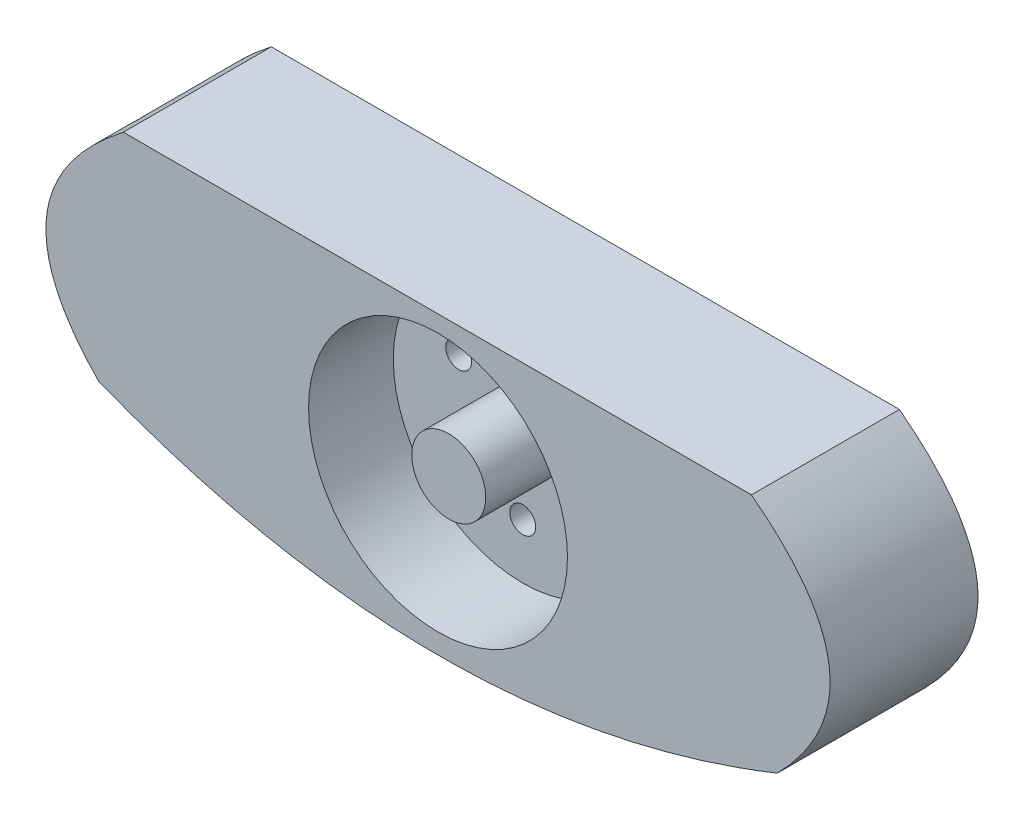
ISO-10303-21;
HEADER;
FILE_DESCRIPTION(('STEP AP214'),'2;1');
FILE_NAME('part.step','',(''),(''),'','','');
FILE_SCHEMA(('AUTOMOTIVE_DESIGN { 1 0 10303 214 1 1 1 1 }'));
ENDSEC;
DATA;
#1=APPLICATION_CONTEXT('core data for automotive mechanical design processes');
#2=APPLICATION_PROTOCOL_DEFINITION('international standard','automotive_design',2000,#1);
#3=PRODUCT_CONTEXT('',#1,'mechanical');
#4=PRODUCT('Part','Part','',(#3));
#5=PRODUCT_RELATED_PRODUCT_CATEGORY('part','',(#4));
#6=PRODUCT_DEFINITION_FORMATION('','',#4);
#7=PRODUCT_DEFINITION_CONTEXT('part definition',#1,'design');
#8=PRODUCT_DEFINITION('design','',#6,#7);
#9=PRODUCT_DEFINITION_SHAPE('','',#8);
#10=(LENGTH_UNIT() NAMED_UNIT(*) SI_UNIT(.MILLI.,.METRE.));
#11=(NAMED_UNIT(*) PLANE_ANGLE_UNIT() SI_UNIT($,.RADIAN.));
#12=(NAMED_UNIT(*) SI_UNIT($,.STERADIAN.) SOLID_ANGLE_UNIT());
#13=UNCERTAINTY_MEASURE_WITH_UNIT(LENGTH_MEASURE(1.E-05),#10,'distance_accuracy_value','');
#14=(GEOMETRIC_REPRESENTATION_CONTEXT(3) GLOBAL_UNCERTAINTY_ASSIGNED_CONTEXT((#13)) GLOBAL_UNIT_ASSIGNED_CONTEXT((#10,
#11,#12)) REPRESENTATION_CONTEXT('',''));
#15=CARTESIAN_POINT('',(0.,0.,0.));
#16=DIRECTION('',(0.,0.,1.));
#17=DIRECTION('',(1.,0.,0.));
#18=AXIS2_PLACEMENT_3D('',#15,#16,#17);
#19=CARTESIAN_POINT('',(-26324.5669752952,999737.504268862,20.));
#20=CARTESIAN_POINT('',(11140.8528513191,-999969.224310154,20.));
#21=CARTESIAN_POINT('',(4048.40687662535,1000075.86398588,20.));
#22=B_SPLINE_CURVE_WITH_KNOTS('',2,(#19,#20,#21),.UNSPECIFIED.,.F.,.F.,(3,3),(0.,1.),.UNSPECIFIED.);
#23=DIRECTION('',(0.,0.,-1.));
#24=VECTOR('',#23,1.);
#25=SURFACE_OF_LINEAR_EXTRUSION('',#22,#24);
#26=CARTESIAN_POINT('',(-26324.5669752952,999737.504268862,0.));
#27=CARTESIAN_POINT('',(11140.8528513191,-999969.224310154,0.));
#28=CARTESIAN_POINT('',(4048.40687662535,1000075.86398588,0.));
#29=B_SPLINE_CURVE_WITH_KNOTS('',2,(#26,#27,#28),.UNSPECIFIED.,.F.,.F.,(3,3),(0.,1.),.UNSPECIFIED.);
#30=CARTESIAN_POINT('',(-45.8736983758243,-22.1554979709055,0.));
#31=VERTEX_POINT('',#30);
#32=CARTESIAN_POINT('',(45.8736984182559,-22.1554979278173,0.));
#33=VERTEX_POINT('',#32);
#34=EDGE_CURVE('E109',#31,#33,#29,.T.);
#35=ORIENTED_EDGE('',*,*,#34,.T.);
#36=DIRECTION('',(0.,0.,-1.));
#37=VECTOR('',#36,1.);
#38=CARTESIAN_POINT('',(45.8736984182559,-22.1554979278173,20.));
#39=LINE('',#38,#37);
#40=CARTESIAN_POINT('',(45.8736984182559,-22.1554979278173,20.));
#41=VERTEX_POINT('',#40);
#42=EDGE_CURVE('E11',#41,#33,#39,.T.);
#43=ORIENTED_EDGE('',*,*,#42,.F.);
#44=CARTESIAN_POINT('',(-45.8736983758243,-22.1554979709055,20.));
#45=VERTEX_POINT('',#44);
#46=EDGE_CURVE('E91',#45,#41,#22,.T.);
#47=ORIENTED_EDGE('',*,*,#46,.F.);
#48=DIRECTION('',(0.,0.,-1.));
#49=VECTOR('',#48,1.);
#50=CARTESIAN_POINT('',(-45.8736983758243,-22.1554979709055,20.));
#51=LINE('',#50,#49);
#52=EDGE_CURVE('E100',#45,#31,#51,.T.);
#53=ORIENTED_EDGE('',*,*,#52,.T.);
#54=EDGE_LOOP('',(#35,#43,#47,#53));
#55=FACE_BOUND('',#54,.T.);
#56=ADVANCED_FACE('F37',(#55),#25,.F.);
#57=CARTESIAN_POINT('',(-998869.892599196,-46700.884225398,20.));
#58=CARTESIAN_POINT('',(999192.30166922,41473.3119298266,20.));
#59=CARTESIAN_POINT('',(-999302.733099754,-36275.1095081386,20.));
#60=B_SPLINE_CURVE_WITH_KNOTS('',2,(#57,#58,#59),.UNSPECIFIED.,.F.,.F.,(3,3),(0.,1.),.UNSPECIFIED.);
#61=DIRECTION('',(0.,0.,-1.));
#62=VECTOR('',#61,1.);
#63=SURFACE_OF_LINEAR_EXTRUSION('',#60,#62);
#64=CARTESIAN_POINT('',(-998869.892599196,-46700.884225398,0.));
#65=CARTESIAN_POINT('',(999192.30166922,41473.3119298266,0.));
#66=CARTESIAN_POINT('',(-999302.733099754,-36275.1095081386,0.));
#67=B_SPLINE_CURVE_WITH_KNOTS('',2,(#64,#65,#66),.UNSPECIFIED.,.F.,.F.,(3,3),(0.,1.),.UNSPECIFIED.);
#68=CARTESIAN_POINT('',(42.3767761233695,8.68321874866895,0.));
#69=VERTEX_POINT('',#68);
#70=EDGE_CURVE('E95',#33,#69,#67,.T.);
#71=ORIENTED_EDGE('',*,*,#70,.T.);
#72=DIRECTION('',(0.,0.,-1.));
#73=VECTOR('',#72,1.);
#74=CARTESIAN_POINT('',(42.3767761233695,8.68321874866895,20.));
#75=LINE('',#74,#73);
#76=CARTESIAN_POINT('',(42.3767761233695,8.68321874866895,20.));
#77=VERTEX_POINT('',#76);
#78=EDGE_CURVE('E47',#77,#69,#75,.T.);
#79=ORIENTED_EDGE('',*,*,#78,.F.);
#80=EDGE_CURVE('E86',#41,#77,#60,.T.);
#81=ORIENTED_EDGE('',*,*,#80,.F.);
#82=ORIENTED_EDGE('',*,*,#42,.T.);
#83=EDGE_LOOP('',(#71,#79,#81,#82));
#84=FACE_BOUND('',#83,.T.);
#85=ADVANCED_FACE('F94',(#84),#63,.F.);
#86=CARTESIAN_POINT('',(42.3767761245835,8.68321874768441,20.));
#87=DIRECTION('',(1.15423428498959E-11,-1.,0.));
#88=DIRECTION('',(1.,1.15423428498959E-11,0.));
#89=AXIS2_PLACEMENT_3D('',#86,#87,#88);
#90=PLANE('',#89);
#91=DIRECTION('',(-1.,-1.15423428498959E-11,0.));
#92=VECTOR('',#91,1.);
#93=CARTESIAN_POINT('',(42.3767761245835,8.68321874768441,0.));
#94=LINE('',#93,#92);
#95=CARTESIAN_POINT('',(-42.5400898319191,8.68321874670427,0.));
#96=VERTEX_POINT('',#95);
#97=EDGE_CURVE('E73',#69,#96,#94,.T.);
#98=ORIENTED_EDGE('',*,*,#97,.T.);
#99=DIRECTION('',(0.,0.,-1.));
#100=VECTOR('',#99,1.);
#101=CARTESIAN_POINT('',(-42.5400898319191,8.68321874670427,20.));
#102=LINE('',#101,#100);
#103=CARTESIAN_POINT('',(-42.5400898319191,8.68321874670427,20.));
#104=VERTEX_POINT('',#103);
#105=EDGE_CURVE('E96',#104,#96,#102,.T.);
#106=ORIENTED_EDGE('',*,*,#105,.F.);
#107=DIRECTION('',(-1.,-1.15423428498959E-11,0.));
#108=VECTOR('',#107,1.);
#109=CARTESIAN_POINT('',(42.3767761245835,8.68321874768441,20.));
#110=LINE('',#109,#108);
#111=EDGE_CURVE('E89',#77,#104,#110,.T.);
#112=ORIENTED_EDGE('',*,*,#111,.F.);
#113=ORIENTED_EDGE('',*,*,#78,.T.);
#114=EDGE_LOOP('',(#98,#106,#112,#113));
#115=FACE_BOUND('',#114,.T.);
#116=ADVANCED_FACE('F98',(#115),#90,.F.);
#117=CARTESIAN_POINT('',(999423.299806603,-32787.8694532893,20.));
#118=CARTESIAN_POINT('',(-999330.20137227,38006.7010376896,20.));
#119=CARTESIAN_POINT('',(999025.115011576,-43254.9699162479,20.));
#120=B_SPLINE_CURVE_WITH_KNOTS('',2,(#117,#118,#119),.UNSPECIFIED.,.F.,.F.,(3,3),(0.,1.),.UNSPECIFIED.);
#121=DIRECTION('',(0.,0.,-1.));
#122=VECTOR('',#121,1.);
#123=SURFACE_OF_LINEAR_EXTRUSION('',#120,#122);
#124=CARTESIAN_POINT('',(999423.299806603,-32787.8694532893,0.));
#125=CARTESIAN_POINT('',(-999330.20137227,38006.7010376896,0.));
#126=CARTESIAN_POINT('',(999025.115011576,-43254.9699162479,0.));
#127=B_SPLINE_CURVE_WITH_KNOTS('',2,(#124,#125,#126),.UNSPECIFIED.,.F.,.F.,(3,3),(0.,1.),.UNSPECIFIED.);
#128=EDGE_CURVE('E79',#96,#31,#127,.T.);
#129=ORIENTED_EDGE('',*,*,#128,.T.);
#130=ORIENTED_EDGE('',*,*,#52,.F.);
#131=EDGE_CURVE('E56',#104,#45,#120,.T.);
#132=ORIENTED_EDGE('',*,*,#131,.F.);
#133=ORIENTED_EDGE('',*,*,#105,.T.);
#134=EDGE_LOOP('',(#129,#130,#132,#133));
#135=FACE_BOUND('',#134,.T.);
#136=ADVANCED_FACE('F117',(#135),#123,.F.);
#137=CARTESIAN_POINT('',(1.38640099212139,-31.2700913924573,20.));
#138=DIRECTION('',(0.,0.,-1.));
#139=DIRECTION('',(-1.,0.,0.));
#140=AXIS2_PLACEMENT_3D('',#137,#138,#139);
#141=PLANE('',#140);
#142=CARTESIAN_POINT('',(0.,-11.0630249070138,20.));
#143=DIRECTION('',(0.,0.,1.));
#144=DIRECTION('',(1.,0.,0.));
#145=AXIS2_PLACEMENT_3D('',#142,#143,#144);
#146=CIRCLE('',#145,17.5);
#147=CARTESIAN_POINT('',(17.5,-11.0630249070138,20.));
#148=VERTEX_POINT('',#147);
#149=EDGE_CURVE('E136',#148,#148,#146,.T.);
#150=ORIENTED_EDGE('',*,*,#149,.F.);
#151=EDGE_LOOP('',(#150));
#152=FACE_BOUND('',#151,.T.);
#153=ORIENTED_EDGE('',*,*,#46,.T.);
#154=ORIENTED_EDGE('',*,*,#80,.T.);
#155=ORIENTED_EDGE('',*,*,#111,.T.);
#156=ORIENTED_EDGE('',*,*,#131,.T.);
#157=EDGE_LOOP('',(#153,#154,#155,#156));
#158=FACE_BOUND('',#157,.T.);
#159=ADVANCED_FACE('F87',(#152,#158),#141,.F.);
#160=CARTESIAN_POINT('',(1.38640099212139,-31.2700913924573,0.));
#161=DIRECTION('',(0.,0.,-1.));
#162=DIRECTION('',(-1.,0.,0.));
#163=AXIS2_PLACEMENT_3D('',#160,#161,#162);
#164=PLANE('',#163);
#165=CARTESIAN_POINT('',(8.66025403784439,-6.12947958638999,0.));
#166=DIRECTION('',(0.,0.,-1.));
#167=DIRECTION('',(-1.,0.,0.));
#168=AXIS2_PLACEMENT_3D('',#165,#166,#167);
#169=CIRCLE('',#168,3.5);
#170=CARTESIAN_POINT('',(5.16025403784439,-6.12947958638999,0.));
#171=VERTEX_POINT('',#170);
#172=EDGE_CURVE('E225',#171,#171,#169,.T.);
#173=ORIENTED_EDGE('',*,*,#172,.F.);
#174=EDGE_LOOP('',(#173));
#175=FACE_BOUND('',#174,.T.);
#176=CARTESIAN_POINT('',(0.,-21.12947958639,0.));
#177=DIRECTION('',(0.,0.,-1.));
#178=DIRECTION('',(-1.,0.,0.));
#179=AXIS2_PLACEMENT_3D('',#176,#177,#178);
#180=CIRCLE('',#179,3.5);
#181=CARTESIAN_POINT('',(-3.5,-21.12947958639,0.));
#182=VERTEX_POINT('',#181);
#183=EDGE_CURVE('E180',#182,#182,#180,.T.);
#184=ORIENTED_EDGE('',*,*,#183,.F.);
#185=EDGE_LOOP('',(#184));
#186=FACE_BOUND('',#185,.T.);
#187=CARTESIAN_POINT('',(-8.66025403784439,-6.12947958638999,0.));
#188=DIRECTION('',(0.,0.,-1.));
#189=DIRECTION('',(-1.,0.,0.));
#190=AXIS2_PLACEMENT_3D('',#187,#188,#189);
#191=CIRCLE('',#190,3.5);
#192=CARTESIAN_POINT('',(-12.1602540378444,-6.12947958638999,0.));
#193=VERTEX_POINT('',#192);
#194=EDGE_CURVE('E167',#193,#193,#191,.T.);
#195=ORIENTED_EDGE('',*,*,#194,.F.);
#196=EDGE_LOOP('',(#195));
#197=FACE_BOUND('',#196,.T.);
#198=ORIENTED_EDGE('',*,*,#34,.F.);
#199=ORIENTED_EDGE('',*,*,#128,.F.);
#200=ORIENTED_EDGE('',*,*,#97,.F.);
#201=ORIENTED_EDGE('',*,*,#70,.F.);
#202=EDGE_LOOP('',(#198,#199,#200,#201));
#203=FACE_BOUND('',#202,.T.);
#204=ADVANCED_FACE('F121',(#175,#186,#197,#203),#164,.T.);
#205=CARTESIAN_POINT('',(0.,-11.0630249070138,8.54674907405911));
#206=DIRECTION('',(0.,0.,1.));
#207=DIRECTION('',(1.,0.,0.));
#208=AXIS2_PLACEMENT_3D('',#205,#206,#207);
#209=CYLINDRICAL_SURFACE('',#208,17.5);
#210=CARTESIAN_POINT('',(0.,-11.0630249070138,8.54674907405911));
#211=DIRECTION('',(0.,0.,1.));
#212=DIRECTION('',(1.,0.,0.));
#213=AXIS2_PLACEMENT_3D('',#210,#211,#212);
#214=CIRCLE('',#213,17.5);
#215=CARTESIAN_POINT('',(17.5,-11.0630249070138,8.54674907405911));
#216=VERTEX_POINT('',#215);
#217=EDGE_CURVE('E134',#216,#216,#214,.T.);
#218=ORIENTED_EDGE('',*,*,#217,.F.);
#219=EDGE_LOOP('',(#218));
#220=FACE_BOUND('',#219,.T.);
#221=ORIENTED_EDGE('',*,*,#149,.T.);
#222=EDGE_LOOP('',(#221));
#223=FACE_BOUND('',#222,.T.);
#224=ADVANCED_FACE('F197',(#220,#223),#209,.F.);
#225=CARTESIAN_POINT('',(0.,-11.0630249070138,8.54674907405911));
#226=DIRECTION('',(0.,0.,1.));
#227=DIRECTION('',(1.,0.,0.));
#228=AXIS2_PLACEMENT_3D('',#225,#226,#227);
#229=PLANE('',#228);
#230=CARTESIAN_POINT('',(8.66025403784439,-6.12947958638999,8.54674907405911));
#231=DIRECTION('',(0.,0.,1.));
#232=DIRECTION('',(1.,0.,0.));
#233=AXIS2_PLACEMENT_3D('',#230,#231,#232);
#234=CIRCLE('',#233,1.75);
#235=CARTESIAN_POINT('',(10.4102540378444,-6.12947958638999,8.54674907405911));
#236=VERTEX_POINT('',#235);
#237=EDGE_CURVE('E41',#236,#236,#234,.T.);
#238=ORIENTED_EDGE('',*,*,#237,.F.);
#239=EDGE_LOOP('',(#238));
#240=FACE_BOUND('',#239,.T.);
#241=CARTESIAN_POINT('',(0.,-21.12947958639,8.54674907405911));
#242=DIRECTION('',(0.,0.,1.));
#243=DIRECTION('',(1.,0.,0.));
#244=AXIS2_PLACEMENT_3D('',#241,#242,#243);
#245=CIRCLE('',#244,1.75);
#246=CARTESIAN_POINT('',(1.75,-21.12947958639,8.54674907405911));
#247=VERTEX_POINT('',#246);
#248=EDGE_CURVE('E165',#247,#247,#245,.T.);
#249=ORIENTED_EDGE('',*,*,#248,.F.);
#250=EDGE_LOOP('',(#249));
#251=FACE_BOUND('',#250,.T.);
#252=CARTESIAN_POINT('',(-8.66025403784439,-6.12947958638999,8.54674907405911));
#253=DIRECTION('',(0.,0.,1.));
#254=DIRECTION('',(1.,0.,0.));
#255=AXIS2_PLACEMENT_3D('',#252,#253,#254);
#256=CIRCLE('',#255,1.75);
#257=CARTESIAN_POINT('',(-6.91025403784439,-6.12947958638999,8.54674907405911));
#258=VERTEX_POINT('',#257);
#259=EDGE_CURVE('E162',#258,#258,#256,.T.);
#260=ORIENTED_EDGE('',*,*,#259,.F.);
#261=EDGE_LOOP('',(#260));
#262=FACE_BOUND('',#261,.T.);
#263=CARTESIAN_POINT('',(0.,-11.0630249070138,8.54674907405911));
#264=DIRECTION('',(0.,0.,1.));
#265=DIRECTION('',(1.,0.,0.));
#266=AXIS2_PLACEMENT_3D('',#263,#264,#265);
#267=CIRCLE('',#266,5.);
#268=CARTESIAN_POINT('',(5.,-11.0630249070138,8.54674907405911));
#269=VERTEX_POINT('',#268);
#270=EDGE_CURVE('E144',#269,#269,#267,.T.);
#271=ORIENTED_EDGE('',*,*,#270,.F.);
#272=EDGE_LOOP('',(#271));
#273=FACE_BOUND('',#272,.T.);
#274=ORIENTED_EDGE('',*,*,#217,.T.);
#275=EDGE_LOOP('',(#274));
#276=FACE_BOUND('',#275,.T.);
#277=ADVANCED_FACE('F195',(#240,#251,#262,#273,#276),#229,.T.);
#278=CARTESIAN_POINT('',(0.,-11.0630249070138,18.5467490740591));
#279=DIRECTION('',(0.,0.,-1.));
#280=DIRECTION('',(-1.,0.,0.));
#281=AXIS2_PLACEMENT_3D('',#278,#279,#280);
#282=CYLINDRICAL_SURFACE('',#281,5.);
#283=CARTESIAN_POINT('',(0.,-11.0630249070138,18.5467490740591));
#284=DIRECTION('',(0.,0.,1.));
#285=DIRECTION('',(1.,0.,0.));
#286=AXIS2_PLACEMENT_3D('',#283,#284,#285);
#287=CIRCLE('',#286,5.);
#288=CARTESIAN_POINT('',(5.,-11.0630249070138,18.5467490740591));
#289=VERTEX_POINT('',#288);
#290=EDGE_CURVE('E141',#289,#289,#287,.T.);
#291=ORIENTED_EDGE('',*,*,#290,.F.);
#292=EDGE_LOOP('',(#291));
#293=FACE_BOUND('',#292,.T.);
#294=ORIENTED_EDGE('',*,*,#270,.T.);
#295=EDGE_LOOP('',(#294));
#296=FACE_BOUND('',#295,.T.);
#297=ADVANCED_FACE('F193',(#293,#296),#282,.T.);
#298=CARTESIAN_POINT('',(0.,-11.0630249070138,18.5467490740591));
#299=DIRECTION('',(0.,0.,1.));
#300=DIRECTION('',(1.,0.,0.));
#301=AXIS2_PLACEMENT_3D('',#298,#299,#300);
#302=PLANE('',#301);
#303=ORIENTED_EDGE('',*,*,#290,.T.);
#304=EDGE_LOOP('',(#303));
#305=FACE_BOUND('',#304,.T.);
#306=ADVANCED_FACE('F204',(#305),#302,.T.);
#307=CARTESIAN_POINT('',(-8.66025403784439,-6.12947958638999,0.));
#308=DIRECTION('',(0.,0.,-1.));
#309=DIRECTION('',(-1.,0.,0.));
#310=AXIS2_PLACEMENT_3D('',#307,#308,#309);
#311=CYLINDRICAL_SURFACE('',#310,1.75);
#312=ORIENTED_EDGE('',*,*,#259,.T.);
#313=EDGE_LOOP('',(#312));
#314=FACE_BOUND('',#313,.T.);
#315=CARTESIAN_POINT('',(-8.66025403784439,-6.12947958638999,4.));
#316=DIRECTION('',(0.,0.,-1.));
#317=DIRECTION('',(-1.,0.,0.));
#318=AXIS2_PLACEMENT_3D('',#315,#316,#317);
#319=CIRCLE('',#318,1.75);
#320=CARTESIAN_POINT('',(-10.4102540378444,-6.12947958638999,4.));
#321=VERTEX_POINT('',#320);
#322=EDGE_CURVE('E164',#321,#321,#319,.T.);
#323=ORIENTED_EDGE('',*,*,#322,.T.);
#324=EDGE_LOOP('',(#323));
#325=FACE_BOUND('',#324,.T.);
#326=ADVANCED_FACE('F243',(#314,#325),#311,.F.);
#327=CARTESIAN_POINT('',(-6.91025403784439,-6.12947958638999,4.));
#328=DIRECTION('',(0.,0.,1.));
#329=DIRECTION('',(1.,0.,0.));
#330=AXIS2_PLACEMENT_3D('',#327,#328,#329);
#331=PLANE('',#330);
#332=ORIENTED_EDGE('',*,*,#322,.F.);
#333=EDGE_LOOP('',(#332));
#334=FACE_BOUND('',#333,.T.);
#335=CARTESIAN_POINT('',(-8.66025403784439,-6.12947958638999,4.));
#336=DIRECTION('',(0.,0.,-1.));
#337=DIRECTION('',(-1.,0.,0.));
#338=AXIS2_PLACEMENT_3D('',#335,#336,#337);
#339=CIRCLE('',#338,3.5);
#340=CARTESIAN_POINT('',(-12.1602540378444,-6.12947958638999,4.));
#341=VERTEX_POINT('',#340);
#342=EDGE_CURVE('E172',#341,#341,#339,.T.);
#343=ORIENTED_EDGE('',*,*,#342,.T.);
#344=EDGE_LOOP('',(#343));
#345=FACE_BOUND('',#344,.T.);
#346=ADVANCED_FACE('F234',(#334,#345),#331,.F.);
#347=CARTESIAN_POINT('',(-8.66025403784439,-6.12947958638999,0.));
#348=DIRECTION('',(0.,0.,-1.));
#349=DIRECTION('',(-1.,0.,0.));
#350=AXIS2_PLACEMENT_3D('',#347,#348,#349);
#351=CYLINDRICAL_SURFACE('',#350,3.5);
#352=ORIENTED_EDGE('',*,*,#342,.F.);
#353=EDGE_LOOP('',(#352));
#354=FACE_BOUND('',#353,.T.);
#355=ORIENTED_EDGE('',*,*,#194,.T.);
#356=EDGE_LOOP('',(#355));
#357=FACE_BOUND('',#356,.T.);
#358=ADVANCED_FACE('F231',(#354,#357),#351,.F.);
#359=CARTESIAN_POINT('',(0.,-21.12947958639,0.));
#360=DIRECTION('',(0.,0.,-1.));
#361=DIRECTION('',(-1.,0.,0.));
#362=AXIS2_PLACEMENT_3D('',#359,#360,#361);
#363=CYLINDRICAL_SURFACE('',#362,1.75);
#364=ORIENTED_EDGE('',*,*,#248,.T.);
#365=EDGE_LOOP('',(#364));
#366=FACE_BOUND('',#365,.T.);
#367=CARTESIAN_POINT('',(0.,-21.12947958639,4.));
#368=DIRECTION('',(0.,0.,-1.));
#369=DIRECTION('',(-1.,0.,0.));
#370=AXIS2_PLACEMENT_3D('',#367,#368,#369);
#371=CIRCLE('',#370,1.75);
#372=CARTESIAN_POINT('',(-1.75,-21.12947958639,4.));
#373=VERTEX_POINT('',#372);
#374=EDGE_CURVE('E168',#373,#373,#371,.T.);
#375=ORIENTED_EDGE('',*,*,#374,.T.);
#376=EDGE_LOOP('',(#375));
#377=FACE_BOUND('',#376,.T.);
#378=ADVANCED_FACE('F233',(#366,#377),#363,.F.);
#379=CARTESIAN_POINT('',(1.75,-21.12947958639,4.));
#380=DIRECTION('',(0.,0.,1.));
#381=DIRECTION('',(1.,0.,0.));
#382=AXIS2_PLACEMENT_3D('',#379,#380,#381);
#383=PLANE('',#382);
#384=ORIENTED_EDGE('',*,*,#374,.F.);
#385=EDGE_LOOP('',(#384));
#386=FACE_BOUND('',#385,.T.);
#387=CARTESIAN_POINT('',(0.,-21.12947958639,4.));
#388=DIRECTION('',(0.,0.,-1.));
#389=DIRECTION('',(-1.,0.,0.));
#390=AXIS2_PLACEMENT_3D('',#387,#388,#389);
#391=CIRCLE('',#390,3.5);
#392=CARTESIAN_POINT('',(-3.5,-21.12947958639,4.));
#393=VERTEX_POINT('',#392);
#394=EDGE_CURVE('E175',#393,#393,#391,.T.);
#395=ORIENTED_EDGE('',*,*,#394,.T.);
#396=EDGE_LOOP('',(#395));
#397=FACE_BOUND('',#396,.T.);
#398=ADVANCED_FACE('F241',(#386,#397),#383,.F.);
#399=CARTESIAN_POINT('',(0.,-21.12947958639,0.));
#400=DIRECTION('',(0.,0.,-1.));
#401=DIRECTION('',(-1.,0.,0.));
#402=AXIS2_PLACEMENT_3D('',#399,#400,#401);
#403=CYLINDRICAL_SURFACE('',#402,3.5);
#404=ORIENTED_EDGE('',*,*,#394,.F.);
#405=EDGE_LOOP('',(#404));
#406=FACE_BOUND('',#405,.T.);
#407=ORIENTED_EDGE('',*,*,#183,.T.);
#408=EDGE_LOOP('',(#407));
#409=FACE_BOUND('',#408,.T.);
#410=ADVANCED_FACE('F286',(#406,#409),#403,.F.);
#411=CARTESIAN_POINT('',(8.66025403784439,-6.12947958638999,0.));
#412=DIRECTION('',(0.,0.,-1.));
#413=DIRECTION('',(-1.,0.,0.));
#414=AXIS2_PLACEMENT_3D('',#411,#412,#413);
#415=CYLINDRICAL_SURFACE('',#414,1.75);
#416=ORIENTED_EDGE('',*,*,#237,.T.);
#417=EDGE_LOOP('',(#416));
#418=FACE_BOUND('',#417,.T.);
#419=CARTESIAN_POINT('',(8.66025403784439,-6.12947958638999,4.));
#420=DIRECTION('',(0.,0.,-1.));
#421=DIRECTION('',(-1.,0.,0.));
#422=AXIS2_PLACEMENT_3D('',#419,#420,#421);
#423=CIRCLE('',#422,1.75);
#424=CARTESIAN_POINT('',(6.91025403784439,-6.12947958638999,4.));
#425=VERTEX_POINT('',#424);
#426=EDGE_CURVE('E415',#425,#425,#423,.T.);
#427=ORIENTED_EDGE('',*,*,#426,.T.);
#428=EDGE_LOOP('',(#427));
#429=FACE_BOUND('',#428,.T.);
#430=ADVANCED_FACE('F296',(#418,#429),#415,.F.);
#431=CARTESIAN_POINT('',(10.4102540378444,-6.12947958638999,4.));
#432=DIRECTION('',(0.,0.,1.));
#433=DIRECTION('',(1.,0.,0.));
#434=AXIS2_PLACEMENT_3D('',#431,#432,#433);
#435=PLANE('',#434);
#436=ORIENTED_EDGE('',*,*,#426,.F.);
#437=EDGE_LOOP('',(#436));
#438=FACE_BOUND('',#437,.T.);
#439=CARTESIAN_POINT('',(8.66025403784439,-6.12947958638999,4.));
#440=DIRECTION('',(0.,0.,-1.));
#441=DIRECTION('',(-1.,0.,0.));
#442=AXIS2_PLACEMENT_3D('',#439,#440,#441);
#443=CIRCLE('',#442,3.5);
#444=CARTESIAN_POINT('',(5.16025403784439,-6.12947958638999,4.));
#445=VERTEX_POINT('',#444);
#446=EDGE_CURVE('E413',#445,#445,#443,.T.);
#447=ORIENTED_EDGE('',*,*,#446,.T.);
#448=EDGE_LOOP('',(#447));
#449=FACE_BOUND('',#448,.T.);
#450=ADVANCED_FACE('F307',(#438,#449),#435,.F.);
#451=CARTESIAN_POINT('',(8.66025403784439,-6.12947958638999,0.));
#452=DIRECTION('',(0.,0.,-1.));
#453=DIRECTION('',(-1.,0.,0.));
#454=AXIS2_PLACEMENT_3D('',#451,#452,#453);
#455=CYLINDRICAL_SURFACE('',#454,3.5);
#456=ORIENTED_EDGE('',*,*,#446,.F.);
#457=EDGE_LOOP('',(#456));
#458=FACE_BOUND('',#457,.T.);
#459=ORIENTED_EDGE('',*,*,#172,.T.);
#460=EDGE_LOOP('',(#459));
#461=FACE_BOUND('',#460,.T.);
#462=ADVANCED_FACE('F318',(#458,#461),#455,.F.);
#463=CLOSED_SHELL('',(#56,#85,#116,#136,#159,#204,#224,#277,#297,#306,#326,#346,#358,#378,#398,
#410,#430,#450,#462));
#464=MANIFOLD_SOLID_BREP('B2',#463);
#465=ADVANCED_BREP_SHAPE_REPRESENTATION('',(#18,#464),#14);
#466=SHAPE_DEFINITION_REPRESENTATION(#9,#465);
ENDSEC;
END-ISO-10303-21;
